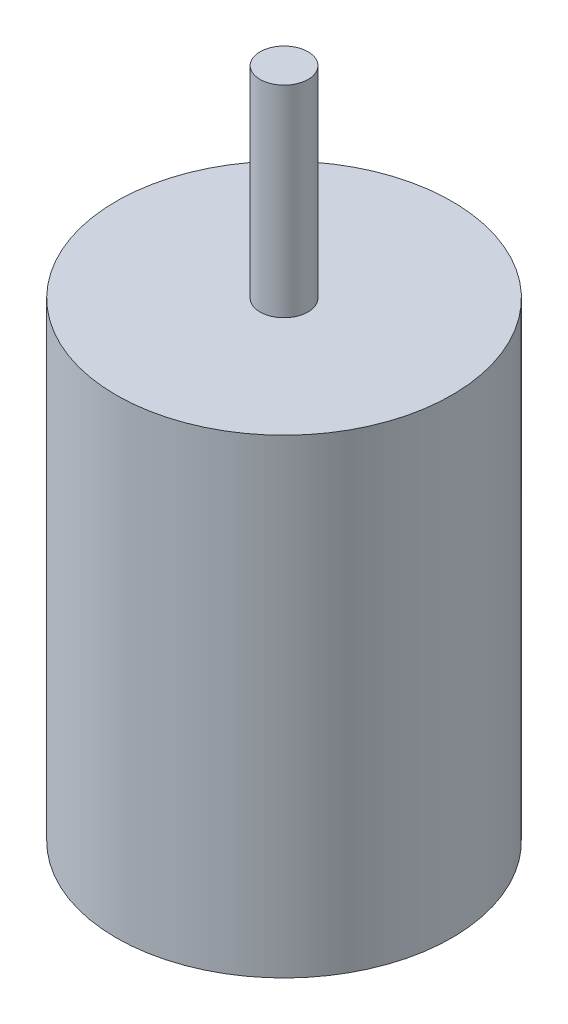
ISO-10303-21;
HEADER;
FILE_DESCRIPTION(('STEP AP214'),'2;1');
FILE_NAME('part.step','',(''),(''),'','','');
FILE_SCHEMA(('AUTOMOTIVE_DESIGN { 1 0 10303 214 1 1 1 1 }'));
ENDSEC;
DATA;
#1=APPLICATION_CONTEXT('core data for automotive mechanical design processes');
#2=APPLICATION_PROTOCOL_DEFINITION('international standard','automotive_design',2000,#1);
#3=PRODUCT_CONTEXT('',#1,'mechanical');
#4=PRODUCT('Part','Part','',(#3));
#5=PRODUCT_RELATED_PRODUCT_CATEGORY('part','',(#4));
#6=PRODUCT_DEFINITION_FORMATION('','',#4);
#7=PRODUCT_DEFINITION_CONTEXT('part definition',#1,'design');
#8=PRODUCT_DEFINITION('design','',#6,#7);
#9=PRODUCT_DEFINITION_SHAPE('','',#8);
#10=(LENGTH_UNIT() NAMED_UNIT(*) SI_UNIT(.MILLI.,.METRE.));
#11=(NAMED_UNIT(*) PLANE_ANGLE_UNIT() SI_UNIT($,.RADIAN.));
#12=(NAMED_UNIT(*) SI_UNIT($,.STERADIAN.) SOLID_ANGLE_UNIT());
#13=UNCERTAINTY_MEASURE_WITH_UNIT(LENGTH_MEASURE(1.E-05),#10,'distance_accuracy_value','');
#14=(GEOMETRIC_REPRESENTATION_CONTEXT(3) GLOBAL_UNCERTAINTY_ASSIGNED_CONTEXT((#13)) GLOBAL_UNIT_ASSIGNED_CONTEXT((#10,
#11,#12)) REPRESENTATION_CONTEXT('',''));
#15=CARTESIAN_POINT('',(0.,0.,0.));
#16=DIRECTION('',(0.,0.,1.));
#17=DIRECTION('',(1.,0.,0.));
#18=AXIS2_PLACEMENT_3D('',#15,#16,#17);
#19=CARTESIAN_POINT('',(0.,70.,0.));
#20=DIRECTION('',(0.,-1.,0.));
#21=DIRECTION('',(0.,0.,-1.));
#22=AXIS2_PLACEMENT_3D('',#19,#20,#21);
#23=CYLINDRICAL_SURFACE('',#22,2.5);
#24=CARTESIAN_POINT('',(0.,49.,0.));
#25=DIRECTION('',(0.,1.,0.));
#26=DIRECTION('',(0.,0.,1.));
#27=AXIS2_PLACEMENT_3D('',#24,#25,#26);
#28=CIRCLE('',#27,2.5);
#29=CARTESIAN_POINT('',(0.,49.,2.5));
#30=VERTEX_POINT('',#29);
#31=EDGE_CURVE('E40',#30,#30,#28,.T.);
#32=ORIENTED_EDGE('',*,*,#31,.T.);
#33=EDGE_LOOP('',(#32));
#34=FACE_BOUND('',#33,.T.);
#35=CARTESIAN_POINT('',(0.,70.,0.));
#36=DIRECTION('',(0.,1.,0.));
#37=DIRECTION('',(0.,0.,1.));
#38=AXIS2_PLACEMENT_3D('',#35,#36,#37);
#39=CIRCLE('',#38,2.5);
#40=CARTESIAN_POINT('',(0.,70.,2.5));
#41=VERTEX_POINT('',#40);
#42=EDGE_CURVE('E10',#41,#41,#39,.T.);
#43=ORIENTED_EDGE('',*,*,#42,.F.);
#44=EDGE_LOOP('',(#43));
#45=FACE_BOUND('',#44,.T.);
#46=ADVANCED_FACE('F37',(#34,#45),#23,.T.);
#47=CARTESIAN_POINT('',(0.,70.,0.));
#48=DIRECTION('',(0.,1.,0.));
#49=DIRECTION('',(0.,0.,1.));
#50=AXIS2_PLACEMENT_3D('',#47,#48,#49);
#51=PLANE('',#50);
#52=ORIENTED_EDGE('',*,*,#42,.T.);
#53=EDGE_LOOP('',(#52));
#54=FACE_BOUND('',#53,.T.);
#55=ADVANCED_FACE('F60',(#54),#51,.T.);
#56=CARTESIAN_POINT('',(0.,49.,0.));
#57=DIRECTION('',(0.,-1.,0.));
#58=DIRECTION('',(0.,0.,-1.));
#59=AXIS2_PLACEMENT_3D('',#56,#57,#58);
#60=CYLINDRICAL_SURFACE('',#59,17.5);
#61=CARTESIAN_POINT('',(0.,49.,0.));
#62=DIRECTION('',(0.,1.,0.));
#63=DIRECTION('',(0.,0.,1.));
#64=AXIS2_PLACEMENT_3D('',#61,#62,#63);
#65=CIRCLE('',#64,17.5);
#66=CARTESIAN_POINT('',(0.,49.,17.5));
#67=VERTEX_POINT('',#66);
#68=EDGE_CURVE('E47',#67,#67,#65,.T.);
#69=ORIENTED_EDGE('',*,*,#68,.F.);
#70=EDGE_LOOP('',(#69));
#71=FACE_BOUND('',#70,.T.);
#72=CARTESIAN_POINT('',(0.,0.,0.));
#73=DIRECTION('',(0.,1.,0.));
#74=DIRECTION('',(0.,0.,1.));
#75=AXIS2_PLACEMENT_3D('',#72,#73,#74);
#76=CIRCLE('',#75,17.5);
#77=CARTESIAN_POINT('',(0.,0.,17.5));
#78=VERTEX_POINT('',#77);
#79=EDGE_CURVE('E49',#78,#78,#76,.T.);
#80=ORIENTED_EDGE('',*,*,#79,.T.);
#81=EDGE_LOOP('',(#80));
#82=FACE_BOUND('',#81,.T.);
#83=ADVANCED_FACE('F57',(#71,#82),#60,.T.);
#84=CARTESIAN_POINT('',(0.,49.,0.));
#85=DIRECTION('',(0.,1.,0.));
#86=DIRECTION('',(0.,0.,1.));
#87=AXIS2_PLACEMENT_3D('',#84,#85,#86);
#88=PLANE('',#87);
#89=ORIENTED_EDGE('',*,*,#31,.F.);
#90=EDGE_LOOP('',(#89));
#91=FACE_BOUND('',#90,.T.);
#92=ORIENTED_EDGE('',*,*,#68,.T.);
#93=EDGE_LOOP('',(#92));
#94=FACE_BOUND('',#93,.T.);
#95=ADVANCED_FACE('F55',(#91,#94),#88,.T.);
#96=CARTESIAN_POINT('',(0.,0.,0.));
#97=DIRECTION('',(0.,1.,0.));
#98=DIRECTION('',(0.,0.,1.));
#99=AXIS2_PLACEMENT_3D('',#96,#97,#98);
#100=PLANE('',#99);
#101=ORIENTED_EDGE('',*,*,#79,.F.);
#102=EDGE_LOOP('',(#101));
#103=FACE_BOUND('',#102,.T.);
#104=ADVANCED_FACE('F64',(#103),#100,.F.);
#105=CLOSED_SHELL('',(#46,#55,#83,#95,#104));
#106=MANIFOLD_SOLID_BREP('B2',#105);
#107=ADVANCED_BREP_SHAPE_REPRESENTATION('',(#18,#106),#14);
#108=SHAPE_DEFINITION_REPRESENTATION(#9,#107);
ENDSEC;
END-ISO-10303-21;
